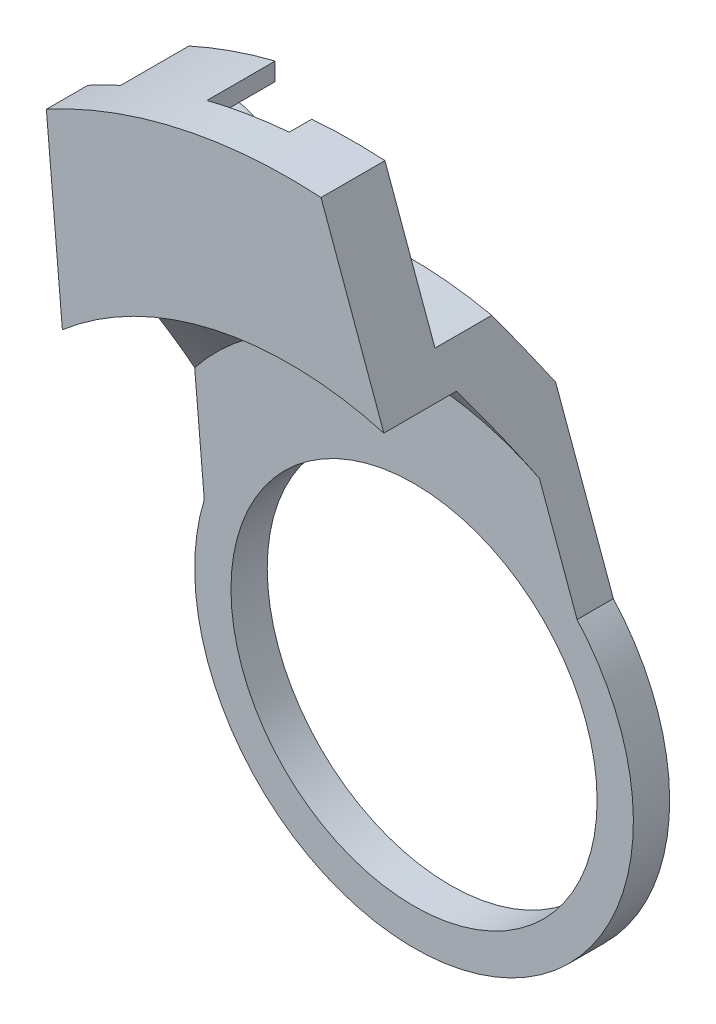
ISO-10303-21;
HEADER;
FILE_DESCRIPTION(('STEP AP214'),'2;1');
FILE_NAME('part.step','',(''),(''),'','','');
FILE_SCHEMA(('AUTOMOTIVE_DESIGN { 1 0 10303 214 1 1 1 1 }'));
ENDSEC;
DATA;
#1=APPLICATION_CONTEXT('core data for automotive mechanical design processes');
#2=APPLICATION_PROTOCOL_DEFINITION('international standard','automotive_design',2000,#1);
#3=PRODUCT_CONTEXT('',#1,'mechanical');
#4=PRODUCT('Part','Part','',(#3));
#5=PRODUCT_RELATED_PRODUCT_CATEGORY('part','',(#4));
#6=PRODUCT_DEFINITION_FORMATION('','',#4);
#7=PRODUCT_DEFINITION_CONTEXT('part definition',#1,'design');
#8=PRODUCT_DEFINITION('design','',#6,#7);
#9=PRODUCT_DEFINITION_SHAPE('','',#8);
#10=(LENGTH_UNIT() NAMED_UNIT(*) SI_UNIT(.MILLI.,.METRE.));
#11=(NAMED_UNIT(*) PLANE_ANGLE_UNIT() SI_UNIT($,.RADIAN.));
#12=(NAMED_UNIT(*) SI_UNIT($,.STERADIAN.) SOLID_ANGLE_UNIT());
#13=UNCERTAINTY_MEASURE_WITH_UNIT(LENGTH_MEASURE(1.E-05),#10,'distance_accuracy_value','');
#14=(GEOMETRIC_REPRESENTATION_CONTEXT(3) GLOBAL_UNCERTAINTY_ASSIGNED_CONTEXT((#13)) GLOBAL_UNIT_ASSIGNED_CONTEXT((#10,
#11,#12)) REPRESENTATION_CONTEXT('',''));
#15=CARTESIAN_POINT('',(0.,0.,0.));
#16=DIRECTION('',(0.,0.,1.));
#17=DIRECTION('',(1.,0.,0.));
#18=AXIS2_PLACEMENT_3D('',#15,#16,#17);
#19=CARTESIAN_POINT('',(0.,0.,0.85));
#20=DIRECTION('',(0.,0.,1.));
#21=DIRECTION('',(1.,0.,0.));
#22=AXIS2_PLACEMENT_3D('',#19,#20,#21);
#23=CYLINDRICAL_SURFACE('',#22,27.55);
#24=CARTESIAN_POINT('',(0.,0.,1.45));
#25=DIRECTION('',(0.,0.,-1.));
#26=DIRECTION('',(-1.,0.,0.));
#27=AXIS2_PLACEMENT_3D('',#24,#25,#26);
#28=CIRCLE('',#27,27.55);
#29=CARTESIAN_POINT('',(-13.7100294494928,23.8963928762071,1.45));
#30=VERTEX_POINT('',#29);
#31=CARTESIAN_POINT('',(-8.80624761480262,26.1046452369456,1.45));
#32=VERTEX_POINT('',#31);
#33=EDGE_CURVE('E163',#30,#32,#28,.T.);
#34=ORIENTED_EDGE('',*,*,#33,.F.);
#35=DIRECTION('',(0.,0.,1.));
#36=VECTOR('',#35,1.);
#37=CARTESIAN_POINT('',(-13.7100294494928,23.8963928762071,0.85));
#38=LINE('',#37,#36);
#39=CARTESIAN_POINT('',(-13.7100294494928,23.8963928762071,4.8));
#40=VERTEX_POINT('',#39);
#41=EDGE_CURVE('E190',#30,#40,#38,.T.);
#42=ORIENTED_EDGE('',*,*,#41,.T.);
#43=CARTESIAN_POINT('',(0.,0.,4.8));
#44=DIRECTION('',(0.,0.,-1.));
#45=DIRECTION('',(1.,0.,0.));
#46=AXIS2_PLACEMENT_3D('',#43,#44,#45);
#47=CIRCLE('',#46,27.55);
#48=CARTESIAN_POINT('',(-8.80624761480262,26.1046452369456,4.8));
#49=VERTEX_POINT('',#48);
#50=EDGE_CURVE('E183',#40,#49,#47,.T.);
#51=ORIENTED_EDGE('',*,*,#50,.T.);
#52=DIRECTION('',(0.,0.,1.));
#53=VECTOR('',#52,1.);
#54=CARTESIAN_POINT('',(-8.80624761480262,26.1046452369456,0.85));
#55=LINE('',#54,#53);
#56=EDGE_CURVE('E177',#32,#49,#55,.T.);
#57=ORIENTED_EDGE('',*,*,#56,.F.);
#58=EDGE_LOOP('',(#34,#42,#51,#57));
#59=FACE_BOUND('',#58,.T.);
#60=ADVANCED_FACE('F17',(#59),#23,.T.);
#61=CARTESIAN_POINT('',(-9.08773375342576,23.318830176005,0.85));
#62=DIRECTION('',(0.,0.,1.));
#63=DIRECTION('',(1.,0.,0.));
#64=AXIS2_PLACEMENT_3D('',#61,#62,#63);
#65=CYLINDRICAL_SURFACE('',#64,2.8);
#66=CARTESIAN_POINT('',(-9.08773375342576,23.318830176005,1.45));
#67=DIRECTION('',(0.,0.,-1.));
#68=DIRECTION('',(-1.,0.,0.));
#69=AXIS2_PLACEMENT_3D('',#66,#67,#68);
#70=CIRCLE('',#69,2.8);
#71=CARTESIAN_POINT('',(-9.08773375342576,20.518830176005,1.45));
#72=VERTEX_POINT('',#71);
#73=EDGE_CURVE('E166',#32,#72,#70,.T.);
#74=ORIENTED_EDGE('',*,*,#73,.F.);
#75=ORIENTED_EDGE('',*,*,#56,.T.);
#76=CARTESIAN_POINT('',(-9.08773375342576,23.318830176005,4.8));
#77=DIRECTION('',(0.,0.,-1.));
#78=DIRECTION('',(-1.,0.,0.));
#79=AXIS2_PLACEMENT_3D('',#76,#77,#78);
#80=CIRCLE('',#79,2.8);
#81=CARTESIAN_POINT('',(-9.08773375342576,20.518830176005,4.8));
#82=VERTEX_POINT('',#81);
#83=EDGE_CURVE('E186',#49,#82,#80,.T.);
#84=ORIENTED_EDGE('',*,*,#83,.T.);
#85=DIRECTION('',(0.,0.,1.));
#86=VECTOR('',#85,1.);
#87=CARTESIAN_POINT('',(-9.08773375342576,20.518830176005,0.85));
#88=LINE('',#87,#86);
#89=EDGE_CURVE('E179',#72,#82,#88,.T.);
#90=ORIENTED_EDGE('',*,*,#89,.F.);
#91=EDGE_LOOP('',(#74,#75,#84,#90));
#92=FACE_BOUND('',#91,.T.);
#93=ADVANCED_FACE('F175',(#92),#65,.T.);
#94=CARTESIAN_POINT('',(-9.08773375342576,20.518830176005,0.85));
#95=DIRECTION('',(0.,1.,0.));
#96=DIRECTION('',(0.,0.,1.));
#97=AXIS2_PLACEMENT_3D('',#94,#95,#96);
#98=PLANE('',#97);
#99=DIRECTION('',(-1.,0.,0.));
#100=VECTOR('',#99,1.);
#101=CARTESIAN_POINT('',(-9.08773375342576,20.518830176005,1.45));
#102=LINE('',#101,#100);
#103=CARTESIAN_POINT('',(-10.5652042274245,20.518830176005,1.45));
#104=VERTEX_POINT('',#103);
#105=EDGE_CURVE('E180',#72,#104,#102,.T.);
#106=ORIENTED_EDGE('',*,*,#105,.F.);
#107=ORIENTED_EDGE('',*,*,#89,.T.);
#108=DIRECTION('',(-1.,0.,0.));
#109=VECTOR('',#108,1.);
#110=CARTESIAN_POINT('',(-9.08773375342576,20.518830176005,4.8));
#111=LINE('',#110,#109);
#112=CARTESIAN_POINT('',(-10.5652042274245,20.518830176005,4.8));
#113=VERTEX_POINT('',#112);
#114=EDGE_CURVE('E185',#82,#113,#111,.T.);
#115=ORIENTED_EDGE('',*,*,#114,.T.);
#116=DIRECTION('',(0.,0.,1.));
#117=VECTOR('',#116,1.);
#118=CARTESIAN_POINT('',(-10.5652042274245,20.518830176005,0.85));
#119=LINE('',#118,#117);
#120=EDGE_CURVE('E198',#104,#113,#119,.T.);
#121=ORIENTED_EDGE('',*,*,#120,.F.);
#122=EDGE_LOOP('',(#106,#107,#115,#121));
#123=FACE_BOUND('',#122,.T.);
#124=ADVANCED_FACE('F360',(#123),#98,.F.);
#125=CARTESIAN_POINT('',(-10.5652042274245,20.518830176005,0.85));
#126=DIRECTION('',(0.4226182617407,0.906307787036649,0.));
#127=DIRECTION('',(-0.906307787036649,0.4226182617407,0.));
#128=AXIS2_PLACEMENT_3D('',#125,#126,#127);
#129=PLANE('',#128);
#130=DIRECTION('',(-0.906307787036649,0.4226182617407,0.));
#131=VECTOR('',#130,1.);
#132=CARTESIAN_POINT('',(-10.5652042274245,20.518830176005,1.45));
#133=LINE('',#132,#131);
#134=CARTESIAN_POINT('',(-13.5357179639975,21.9040034800236,1.45));
#135=VERTEX_POINT('',#134);
#136=EDGE_CURVE('E37',#104,#135,#133,.T.);
#137=ORIENTED_EDGE('',*,*,#136,.F.);
#138=ORIENTED_EDGE('',*,*,#120,.T.);
#139=DIRECTION('',(-0.906307787036649,0.4226182617407,0.));
#140=VECTOR('',#139,1.);
#141=CARTESIAN_POINT('',(-10.5652042274245,20.518830176005,4.8));
#142=LINE('',#141,#140);
#143=CARTESIAN_POINT('',(-13.5357179639975,21.9040034800236,4.8));
#144=VERTEX_POINT('',#143);
#145=EDGE_CURVE('E197',#113,#144,#142,.T.);
#146=ORIENTED_EDGE('',*,*,#145,.T.);
#147=DIRECTION('',(0.,0.,1.));
#148=VECTOR('',#147,1.);
#149=CARTESIAN_POINT('',(-13.5357179639975,21.9040034800236,0.85));
#150=LINE('',#149,#148);
#151=EDGE_CURVE('E201',#135,#144,#150,.T.);
#152=ORIENTED_EDGE('',*,*,#151,.F.);
#153=EDGE_LOOP('',(#137,#138,#146,#152));
#154=FACE_BOUND('',#153,.T.);
#155=ADVANCED_FACE('F365',(#154),#129,.F.);
#156=CARTESIAN_POINT('',(-13.5357179639975,21.9040034800236,0.85));
#157=DIRECTION('',(0.996194698091745,0.0871557427476623,0.));
#158=DIRECTION('',(-0.0871557427476623,0.996194698091745,0.));
#159=AXIS2_PLACEMENT_3D('',#156,#157,#158);
#160=PLANE('',#159);
#161=DIRECTION('',(-0.0871557427476621,0.996194698091745,0.));
#162=VECTOR('',#161,1.);
#163=CARTESIAN_POINT('',(-13.5357179639975,21.9040034800236,1.45));
#164=LINE('',#163,#162);
#165=EDGE_CURVE('E168',#135,#30,#164,.T.);
#166=ORIENTED_EDGE('',*,*,#165,.F.);
#167=ORIENTED_EDGE('',*,*,#151,.T.);
#168=DIRECTION('',(-0.0871557427476623,0.996194698091745,0.));
#169=VECTOR('',#168,1.);
#170=CARTESIAN_POINT('',(-13.5357179639975,21.9040034800236,4.8));
#171=LINE('',#170,#169);
#172=EDGE_CURVE('E200',#144,#40,#171,.T.);
#173=ORIENTED_EDGE('',*,*,#172,.T.);
#174=ORIENTED_EDGE('',*,*,#41,.F.);
#175=EDGE_LOOP('',(#166,#167,#173,#174));
#176=FACE_BOUND('',#175,.T.);
#177=ADVANCED_FACE('F369',(#176),#160,.F.);
#178=CARTESIAN_POINT('',(0.,0.,4.8));
#179=DIRECTION('',(0.,0.,-1.));
#180=DIRECTION('',(-1.,0.,0.));
#181=AXIS2_PLACEMENT_3D('',#178,#179,#180);
#182=PLANE('',#181);
#183=ORIENTED_EDGE('',*,*,#83,.F.);
#184=ORIENTED_EDGE('',*,*,#50,.F.);
#185=ORIENTED_EDGE('',*,*,#172,.F.);
#186=ORIENTED_EDGE('',*,*,#145,.F.);
#187=ORIENTED_EDGE('',*,*,#114,.F.);
#188=EDGE_LOOP('',(#183,#184,#185,#186,#187));
#189=FACE_BOUND('',#188,.T.);
#190=CARTESIAN_POINT('',(0.,0.,4.8));
#191=DIRECTION('',(0.,0.,-1.));
#192=DIRECTION('',(-1.,0.,0.));
#193=AXIS2_PLACEMENT_3D('',#190,#191,#192);
#194=CIRCLE('',#193,29.5);
#195=CARTESIAN_POINT('',(-7.18773375342576,28.6109504122087,4.8));
#196=VERTEX_POINT('',#195);
#197=CARTESIAN_POINT('',(-2.42470673773855,29.4001836258886,4.8));
#198=VERTEX_POINT('',#197);
#199=EDGE_CURVE('E243',#196,#198,#194,.T.);
#200=ORIENTED_EDGE('',*,*,#199,.T.);
#201=DIRECTION('',(-0.342020143325672,0.939692620785907,0.));
#202=VECTOR('',#201,1.);
#203=CARTESIAN_POINT('',(-2.42470673773856,29.4001836258886,4.8));
#204=LINE('',#203,#202);
#205=CARTESIAN_POINT('',(0.269339940357037,21.9983512108641,4.8));
#206=VERTEX_POINT('',#205);
#207=EDGE_CURVE('E470',#206,#198,#204,.T.);
#208=ORIENTED_EDGE('',*,*,#207,.F.);
#209=CARTESIAN_POINT('',(0.,0.,4.8));
#210=DIRECTION('',(0.,0.,1.));
#211=DIRECTION('',(-1.,0.,0.));
#212=AXIS2_PLACEMENT_3D('',#209,#210,#211);
#213=CIRCLE('',#212,22.);
#214=CARTESIAN_POINT('',(-13.35,17.4864947888363,4.8));
#215=VERTEX_POINT('',#214);
#216=EDGE_CURVE('E246',#206,#215,#213,.T.);
#217=ORIENTED_EDGE('',*,*,#216,.T.);
#218=DIRECTION('',(-0.0871557427476605,0.996194698091745,0.));
#219=VECTOR('',#218,1.);
#220=CARTESIAN_POINT('',(-13.35,17.4864947888363,4.8));
#221=LINE('',#220,#219);
#222=CARTESIAN_POINT('',(-14.0877337534258,25.918830176005,4.8));
#223=VERTEX_POINT('',#222);
#224=EDGE_CURVE('E248',#215,#223,#221,.T.);
#225=ORIENTED_EDGE('',*,*,#224,.T.);
#226=CARTESIAN_POINT('',(-12.1877337534258,26.8646449065609,4.8));
#227=VERTEX_POINT('',#226);
#228=EDGE_CURVE('E244',#223,#227,#194,.T.);
#229=ORIENTED_EDGE('',*,*,#228,.T.);
#230=DIRECTION('',(0.,1.,0.));
#231=VECTOR('',#230,1.);
#232=CARTESIAN_POINT('',(-12.1877337534258,25.7625531723004,4.8));
#233=LINE('',#232,#231);
#234=CARTESIAN_POINT('',(-12.1877337534258,25.7625531723004,4.8));
#235=VERTEX_POINT('',#234);
#236=EDGE_CURVE('E213',#235,#227,#233,.T.);
#237=ORIENTED_EDGE('',*,*,#236,.F.);
#238=CARTESIAN_POINT('',(0.,0.,4.8));
#239=DIRECTION('',(0.,0.,1.));
#240=DIRECTION('',(1.,0.,0.));
#241=AXIS2_PLACEMENT_3D('',#238,#239,#240);
#242=CIRCLE('',#241,28.5);
#243=CARTESIAN_POINT('',(-7.18773375342576,27.5787324489336,4.8));
#244=VERTEX_POINT('',#243);
#245=EDGE_CURVE('E203',#244,#235,#242,.T.);
#246=ORIENTED_EDGE('',*,*,#245,.F.);
#247=DIRECTION('',(0.,-1.,0.));
#248=VECTOR('',#247,1.);
#249=CARTESIAN_POINT('',(-7.18773375342576,27.5787324489336,4.8));
#250=LINE('',#249,#248);
#251=EDGE_CURVE('E216',#196,#244,#250,.T.);
#252=ORIENTED_EDGE('',*,*,#251,.F.);
#253=EDGE_LOOP('',(#200,#208,#217,#225,#229,#237,#246,#252));
#254=FACE_BOUND('',#253,.T.);
#255=ADVANCED_FACE('F373',(#189,#254),#182,.T.);
#256=CARTESIAN_POINT('',(0.,0.,-2.1));
#257=DIRECTION('',(0.,0.,1.));
#258=DIRECTION('',(1.,0.,0.));
#259=AXIS2_PLACEMENT_3D('',#256,#257,#258);
#260=CYLINDRICAL_SURFACE('',#259,22.);
#261=DIRECTION('',(0.,0.,1.));
#262=VECTOR('',#261,1.);
#263=CARTESIAN_POINT('',(0.269339940357079,21.9983512108641,-9.87786934547322));
#264=LINE('',#263,#262);
#265=CARTESIAN_POINT('',(0.269339940357079,21.9983512108641,3.5));
#266=VERTEX_POINT('',#265);
#267=EDGE_CURVE('E45',#266,#206,#264,.T.);
#268=ORIENTED_EDGE('',*,*,#267,.F.);
#269=CARTESIAN_POINT('',(0.,0.,3.5));
#270=DIRECTION('',(0.,0.,1.));
#271=DIRECTION('',(1.,0.,0.));
#272=AXIS2_PLACEMENT_3D('',#269,#270,#271);
#273=CIRCLE('',#272,22.);
#274=CARTESIAN_POINT('',(4.71120765737245,21.4896375588122,3.5));
#275=VERTEX_POINT('',#274);
#276=EDGE_CURVE('E477',#266,#275,#273,.F.);
#277=ORIENTED_EDGE('',*,*,#276,.T.);
#278=DIRECTION('',(0.,0.,1.));
#279=VECTOR('',#278,1.);
#280=CARTESIAN_POINT('',(4.71120765737249,21.4896375588122,-2.09999999999996));
#281=LINE('',#280,#279);
#282=CARTESIAN_POINT('',(4.71120765737247,21.4896375588122,0.210684876092078));
#283=VERTEX_POINT('',#282);
#284=EDGE_CURVE('E294',#283,#275,#281,.T.);
#285=ORIENTED_EDGE('',*,*,#284,.F.);
#286=CARTESIAN_POINT('',(0.,0.,0.210684876092046));
#287=DIRECTION('',(0.,0.,-1.));
#288=DIRECTION('',(-1.,0.,0.));
#289=AXIS2_PLACEMENT_3D('',#286,#287,#288);
#290=CIRCLE('',#289,22.);
#291=CARTESIAN_POINT('',(-13.35,17.4864947888363,0.21068487609195));
#292=VERTEX_POINT('',#291);
#293=EDGE_CURVE('E314',#283,#292,#290,.F.);
#294=ORIENTED_EDGE('',*,*,#293,.T.);
#295=DIRECTION('',(0.,0.,1.));
#296=VECTOR('',#295,1.);
#297=CARTESIAN_POINT('',(-13.35,17.4864947888363,-2.10000000000009));
#298=LINE('',#297,#296);
#299=EDGE_CURVE('E297',#292,#215,#298,.T.);
#300=ORIENTED_EDGE('',*,*,#299,.T.);
#301=ORIENTED_EDGE('',*,*,#216,.F.);
#302=EDGE_LOOP('',(#268,#277,#285,#294,#300,#301));
#303=FACE_BOUND('',#302,.T.);
#304=ADVANCED_FACE('F329',(#303),#260,.T.);
#305=CARTESIAN_POINT('',(0.,0.,0.));
#306=DIRECTION('',(0.,0.,-1.));
#307=DIRECTION('',(-1.,0.,0.));
#308=AXIS2_PLACEMENT_3D('',#305,#306,#307);
#309=PLANE('',#308);
#310=CARTESIAN_POINT('',(0.,0.,0.));
#311=DIRECTION('',(0.,0.,-1.));
#312=DIRECTION('',(-1.,0.,0.));
#313=AXIS2_PLACEMENT_3D('',#310,#311,#312);
#314=CIRCLE('',#313,10.6);
#315=CARTESIAN_POINT('',(-10.6,0.,0.));
#316=VERTEX_POINT('',#315);
#317=EDGE_CURVE('E269',#316,#316,#314,.T.);
#318=ORIENTED_EDGE('',*,*,#317,.T.);
#319=EDGE_LOOP('',(#318));
#320=FACE_BOUND('',#319,.T.);
#321=DIRECTION('',(0.342020143325672,-0.939692620785907,0.));
#322=VECTOR('',#321,1.);
#323=CARTESIAN_POINT('',(9.44104993694518,8.49450269810466,0.));
#324=LINE('',#323,#322);
#325=CARTESIAN_POINT('',(7.2621136499808,14.4810809449695,0.));
#326=VERTEX_POINT('',#325);
#327=CARTESIAN_POINT('',(9.44104993694518,8.49450269810466,0.));
#328=VERTEX_POINT('',#327);
#329=EDGE_CURVE('E281',#326,#328,#324,.T.);
#330=ORIENTED_EDGE('',*,*,#329,.F.);
#331=CARTESIAN_POINT('',(0.,0.,0.));
#332=DIRECTION('',(0.,0.,-1.));
#333=DIRECTION('',(-1.,0.,0.));
#334=AXIS2_PLACEMENT_3D('',#331,#332,#333);
#335=CIRCLE('',#334,16.2);
#336=CARTESIAN_POINT('',(-12.7000295316049,10.0572983398306,0.));
#337=VERTEX_POINT('',#336);
#338=EDGE_CURVE('E336',#326,#337,#335,.F.);
#339=ORIENTED_EDGE('',*,*,#338,.T.);
#340=DIRECTION('',(-0.0871557427476617,0.996194698091745,0.));
#341=VECTOR('',#340,1.);
#342=CARTESIAN_POINT('',(-12.1450047037638,3.71333552827576,0.));
#343=LINE('',#342,#341);
#344=CARTESIAN_POINT('',(-12.1450047037638,3.71333552827576,0.));
#345=VERTEX_POINT('',#344);
#346=EDGE_CURVE('E278',#345,#337,#343,.T.);
#347=ORIENTED_EDGE('',*,*,#346,.F.);
#348=CARTESIAN_POINT('',(0.,0.,0.));
#349=DIRECTION('',(0.,0.,-1.));
#350=DIRECTION('',(-1.,0.,0.));
#351=AXIS2_PLACEMENT_3D('',#348,#349,#350);
#352=CIRCLE('',#351,12.7);
#353=EDGE_CURVE('E275',#328,#345,#352,.T.);
#354=ORIENTED_EDGE('',*,*,#353,.F.);
#355=EDGE_LOOP('',(#330,#339,#347,#354));
#356=FACE_BOUND('',#355,.T.);
#357=ADVANCED_FACE('F408',(#320,#356),#309,.F.);
#358=CARTESIAN_POINT('',(0.,0.,-2.1));
#359=DIRECTION('',(0.,0.,-1.));
#360=DIRECTION('',(-1.,0.,0.));
#361=AXIS2_PLACEMENT_3D('',#358,#359,#360);
#362=PLANE('',#361);
#363=DIRECTION('',(-0.0871557427476617,0.996194698091745,0.));
#364=VECTOR('',#363,1.);
#365=CARTESIAN_POINT('',(-12.1450047037638,3.71333552827576,-2.10000000000008));
#366=LINE('',#365,#364);
#367=CARTESIAN_POINT('',(-12.1450047037638,3.71333552827576,-2.10000000000008));
#368=VERTEX_POINT('',#367);
#369=CARTESIAN_POINT('',(-12.9964605343085,13.4455202048921,-2.10000000000009));
#370=VERTEX_POINT('',#369);
#371=EDGE_CURVE('E286',#368,#370,#366,.T.);
#372=ORIENTED_EDGE('',*,*,#371,.T.);
#373=CARTESIAN_POINT('',(0.,0.,-2.1));
#374=DIRECTION('',(0.,0.,-1.));
#375=DIRECTION('',(-1.,0.,0.));
#376=AXIS2_PLACEMENT_3D('',#373,#374,#375);
#377=CIRCLE('',#376,18.7);
#378=CARTESIAN_POINT('',(6.09869221354234,17.6775550708936,-2.09999999999996));
#379=VERTEX_POINT('',#378);
#380=EDGE_CURVE('E303',#370,#379,#377,.T.);
#381=ORIENTED_EDGE('',*,*,#380,.T.);
#382=DIRECTION('',(0.342020143325672,-0.939692620785907,0.));
#383=VECTOR('',#382,1.);
#384=CARTESIAN_POINT('',(9.4410499369452,8.49450269810466,-2.09999999999993));
#385=LINE('',#384,#383);
#386=CARTESIAN_POINT('',(9.4410499369452,8.49450269810466,-2.09999999999993));
#387=VERTEX_POINT('',#386);
#388=EDGE_CURVE('E289',#379,#387,#385,.T.);
#389=ORIENTED_EDGE('',*,*,#388,.T.);
#390=CARTESIAN_POINT('',(0.,0.,-2.1));
#391=DIRECTION('',(0.,0.,-1.));
#392=DIRECTION('',(-1.,0.,0.));
#393=AXIS2_PLACEMENT_3D('',#390,#391,#392);
#394=CIRCLE('',#393,12.7);
#395=EDGE_CURVE('E283',#387,#368,#394,.T.);
#396=ORIENTED_EDGE('',*,*,#395,.T.);
#397=EDGE_LOOP('',(#372,#381,#389,#396));
#398=FACE_BOUND('',#397,.T.);
#399=CARTESIAN_POINT('',(0.,0.,-2.1));
#400=DIRECTION('',(0.,0.,-1.));
#401=DIRECTION('',(-1.,0.,0.));
#402=AXIS2_PLACEMENT_3D('',#399,#400,#401);
#403=CIRCLE('',#402,10.6);
#404=CARTESIAN_POINT('',(-10.6,0.,-2.10000000000007));
#405=VERTEX_POINT('',#404);
#406=EDGE_CURVE('E272',#405,#405,#403,.T.);
#407=ORIENTED_EDGE('',*,*,#406,.F.);
#408=EDGE_LOOP('',(#407));
#409=FACE_BOUND('',#408,.T.);
#410=ADVANCED_FACE('F327',(#398,#409),#362,.T.);
#411=CARTESIAN_POINT('',(0.,0.,-2.1));
#412=DIRECTION('',(0.,0.,1.));
#413=DIRECTION('',(1.,0.,0.));
#414=AXIS2_PLACEMENT_3D('',#411,#412,#413);
#415=CYLINDRICAL_SURFACE('',#414,12.7);
#416=ORIENTED_EDGE('',*,*,#353,.T.);
#417=DIRECTION('',(0.,0.,1.));
#418=VECTOR('',#417,1.);
#419=CARTESIAN_POINT('',(-12.1450047037638,3.71333552827576,-2.10000000000008));
#420=LINE('',#419,#418);
#421=EDGE_CURVE('E300',#368,#345,#420,.T.);
#422=ORIENTED_EDGE('',*,*,#421,.F.);
#423=ORIENTED_EDGE('',*,*,#395,.F.);
#424=DIRECTION('',(0.,0.,1.));
#425=VECTOR('',#424,1.);
#426=CARTESIAN_POINT('',(9.4410499369452,8.49450269810466,-2.09999999999993));
#427=LINE('',#426,#425);
#428=EDGE_CURVE('E291',#387,#328,#427,.T.);
#429=ORIENTED_EDGE('',*,*,#428,.T.);
#430=EDGE_LOOP('',(#416,#422,#423,#429));
#431=FACE_BOUND('',#430,.T.);
#432=ADVANCED_FACE('F19',(#431),#415,.T.);
#433=CARTESIAN_POINT('',(-12.1450047037638,3.71333552827576,-2.10000000000008));
#434=DIRECTION('',(0.996194698091745,0.0871557427476617,0.));
#435=DIRECTION('',(-0.0871557427476617,0.996194698091745,0.));
#436=AXIS2_PLACEMENT_3D('',#433,#434,#435);
#437=PLANE('',#436);
#438=ORIENTED_EDGE('',*,*,#299,.F.);
#439=CARTESIAN_POINT('',(-13.35,17.4864947888363,0.210684876091952));
#440=CARTESIAN_POINT('',(-13.3208135355553,17.1528919737008,0.0126280825053441));
#441=CARTESIAN_POINT('',(-13.2915692061198,16.8186277586933,-0.184312093127229));
#442=CARTESIAN_POINT('',(-13.2329509022123,16.1486174791315,-0.57557276921442));
#443=CARTESIAN_POINT('',(-13.2035769382491,15.8128715346933,-0.769893477019836));
#444=CARTESIAN_POINT('',(-13.144680267403,15.1396795064639,-1.15556397331109));
#445=CARTESIAN_POINT('',(-13.115157557803,14.8022333916164,-1.3469137072646));
#446=CARTESIAN_POINT('',(-13.055941486756,14.125390602385,-1.72616719532516));
#447=CARTESIAN_POINT('',(-13.0262481118897,13.7859937746177,-1.91407067344867));
#448=CARTESIAN_POINT('',(-12.9964605343085,13.4455202048921,-2.10000000000009));
#449=B_SPLINE_CURVE_WITH_KNOTS('',3,(#439,#440,#441,#442,#443,#444,#445,#446,#447,#448),
.UNSPECIFIED.,.F.,.F.,(4,2,2,2,4),(0.,1.16718792952777,2.33428291820314,3.5013993036859,
4.66860874979906),.UNSPECIFIED.);
#450=EDGE_CURVE('E426',#292,#370,#449,.T.);
#451=ORIENTED_EDGE('',*,*,#450,.T.);
#452=ORIENTED_EDGE('',*,*,#371,.F.);
#453=ORIENTED_EDGE('',*,*,#421,.T.);
#454=ORIENTED_EDGE('',*,*,#346,.T.);
#455=CARTESIAN_POINT('',(-12.7000295316049,10.0572983398306,0.));
#456=CARTESIAN_POINT('',(-12.7196632564629,10.2817128418554,0.116040973139817));
#457=CARTESIAN_POINT('',(-12.7392309765462,10.5053729058533,0.233540813811844));
#458=CARTESIAN_POINT('',(-12.7782439838715,10.9512936200695,0.471171993058312));
#459=CARTESIAN_POINT('',(-12.797689274701,11.1735543112929,0.591303254059072));
#460=CARTESIAN_POINT('',(-12.8558453373986,11.8382811496488,0.955148537336075));
#461=CARTESIAN_POINT('',(-12.8943886985474,12.2788337835044,1.20238777595536));
#462=CARTESIAN_POINT('',(-12.9710924457275,13.1555616255899,1.70444071175838));
#463=CARTESIAN_POINT('',(-13.0092528692682,13.5917372625563,1.95925365719961));
#464=CARTESIAN_POINT('',(-13.0662581050014,14.243310088518,2.34618386668656));
#465=CARTESIAN_POINT('',(-13.085223663507,14.4600874141877,2.47596709398291));
#466=CARTESIAN_POINT('',(-13.1230801823881,14.8927894049991,2.73695286529456));
#467=CARTESIAN_POINT('',(-13.1419711435952,15.1087140796458,2.86815539342646));
#468=CARTESIAN_POINT('',(-13.1608280025071,15.3242489632747,3.));
#469=B_SPLINE_CURVE_WITH_KNOTS('',3,(#455,#456,#457,#458,#459,#460,#461,#462,#463,#464,#465,
#466,#467,#468),.UNSPECIFIED.,.F.,.F.,(4,2,2,2,2,2,4),(0.,0.760194183971169,1.52036598766901,
3.04022902007841,4.55994169611442,5.32004379715684,6.08013740068076),.UNSPECIFIED.);
#470=CARTESIAN_POINT('',(-13.1608280025071,15.3242489632747,3.));
#471=VERTEX_POINT('',#470);
#472=EDGE_CURVE('E11',#337,#471,#469,.T.);
#473=ORIENTED_EDGE('',*,*,#472,.T.);
#474=DIRECTION('',(0.,0.,-1.));
#475=VECTOR('',#474,1.);
#476=CARTESIAN_POINT('',(-13.1608280025071,15.3242489632747,7.2));
#477=LINE('',#476,#475);
#478=CARTESIAN_POINT('',(-13.1608280025071,15.3242489632747,7.2));
#479=VERTEX_POINT('',#478);
#480=EDGE_CURVE('E263',#479,#471,#477,.T.);
#481=ORIENTED_EDGE('',*,*,#480,.F.);
#482=DIRECTION('',(0.0871557427476607,-0.996194698091745,0.));
#483=VECTOR('',#482,1.);
#484=CARTESIAN_POINT('',(-13.1608280025071,15.3242489632747,7.2));
#485=LINE('',#484,#483);
#486=CARTESIAN_POINT('',(-14.0877337534258,25.918830176005,7.2));
#487=VERTEX_POINT('',#486);
#488=EDGE_CURVE('E261',#487,#479,#485,.T.);
#489=ORIENTED_EDGE('',*,*,#488,.F.);
#490=DIRECTION('',(0.,0.,1.));
#491=VECTOR('',#490,1.);
#492=CARTESIAN_POINT('',(-14.0877337534258,25.918830176005,4.8));
#493=LINE('',#492,#491);
#494=EDGE_CURVE('E250',#223,#487,#493,.T.);
#495=ORIENTED_EDGE('',*,*,#494,.F.);
#496=ORIENTED_EDGE('',*,*,#224,.F.);
#497=EDGE_LOOP('',(#438,#451,#452,#453,#454,#473,#481,#489,#495,#496));
#498=FACE_BOUND('',#497,.T.);
#499=ADVANCED_FACE('F325',(#498),#437,.F.);
#500=CARTESIAN_POINT('',(9.4410499369452,8.49450269810466,-2.09999999999993));
#501=DIRECTION('',(-0.939692620785907,-0.342020143325672,0.));
#502=DIRECTION('',(0.342020143325672,-0.939692620785907,0.));
#503=AXIS2_PLACEMENT_3D('',#500,#501,#502);
#504=PLANE('',#503);
#505=ORIENTED_EDGE('',*,*,#388,.F.);
#506=CARTESIAN_POINT('',(6.09869221354234,17.6775550708936,-2.09999999999996));
#507=CARTESIAN_POINT('',(5.98178882227377,17.9987444986617,-1.9140740839902));
#508=CARTESIAN_POINT('',(5.86525526198425,18.3189178241658,-1.72617298448005));
#509=CARTESIAN_POINT('',(5.63285821679118,18.9574234581817,-1.34692247685162));
#510=CARTESIAN_POINT('',(5.51699467915911,19.275755911564,-1.15557334509743));
#511=CARTESIAN_POINT('',(5.28585158125516,19.9108163537178,-0.769902541346014));
#512=CARTESIAN_POINT('',(5.17057201030686,20.2275443718227,-0.575580923956549));
#513=CARTESIAN_POINT('',(4.94052175961255,20.8596022409452,-0.184317107060296));
#514=CARTESIAN_POINT('',(4.825751121159,21.1749319785127,0.0126253000801795));
#515=CARTESIAN_POINT('',(4.71120765737248,21.4896375588122,0.210684876092079));
#516=B_SPLINE_CURVE_WITH_KNOTS('',3,(#506,#507,#508,#509,#510,#511,#512,#513,#514,#515),
.UNSPECIFIED.,.F.,.F.,(4,2,2,2,4),(0.,1.16727971816436,2.33446628992401,3.50163144489886,
4.66888962638052),.UNSPECIFIED.);
#517=EDGE_CURVE('E306',#379,#283,#516,.T.);
#518=ORIENTED_EDGE('',*,*,#517,.T.);
#519=ORIENTED_EDGE('',*,*,#284,.T.);
#520=DIRECTION('',(-0.342020143325671,0.939692620785907,0.));
#521=VECTOR('',#520,1.);
#522=CARTESIAN_POINT('',(4.71120765737247,21.4896375588122,3.5));
#523=LINE('',#522,#521);
#524=CARTESIAN_POINT('',(1.81603877507083,29.4440486884437,3.5));
#525=VERTEX_POINT('',#524);
#526=EDGE_CURVE('E210',#275,#525,#523,.T.);
#527=ORIENTED_EDGE('',*,*,#526,.T.);
#528=DIRECTION('',(0.,0.,1.));
#529=VECTOR('',#528,1.);
#530=CARTESIAN_POINT('',(1.81603877507082,29.4440486884437,4.8));
#531=LINE('',#530,#529);
#532=CARTESIAN_POINT('',(1.81603877507082,29.4440486884437,7.2));
#533=VERTEX_POINT('',#532);
#534=EDGE_CURVE('E253',#525,#533,#531,.T.);
#535=ORIENTED_EDGE('',*,*,#534,.T.);
#536=DIRECTION('',(-0.342020143325673,0.939692620785907,0.));
#537=VECTOR('',#536,1.);
#538=CARTESIAN_POINT('',(4.71120765737247,21.4896375588122,7.2));
#539=LINE('',#538,#537);
#540=CARTESIAN_POINT('',(5.45361649394796,19.4498860443175,7.2));
#541=VERTEX_POINT('',#540);
#542=EDGE_CURVE('E259',#541,#533,#539,.T.);
#543=ORIENTED_EDGE('',*,*,#542,.F.);
#544=DIRECTION('',(0.,0.,-1.));
#545=VECTOR('',#544,1.);
#546=CARTESIAN_POINT('',(5.45361649394796,19.4498860443175,7.2));
#547=LINE('',#546,#545);
#548=CARTESIAN_POINT('',(5.45361649394796,19.4498860443175,3.));
#549=VERTEX_POINT('',#548);
#550=EDGE_CURVE('E266',#541,#549,#547,.T.);
#551=ORIENTED_EDGE('',*,*,#550,.T.);
#552=CARTESIAN_POINT('',(5.45361649394796,19.4498860443175,3.));
#553=CARTESIAN_POINT('',(5.52762356498741,19.2465532877567,2.86815128612103));
#554=CARTESIAN_POINT('',(5.601764527876,19.0428526663637,2.73694501958117));
#555=CARTESIAN_POINT('',(5.75033933400916,18.634646741413,2.47595259889635));
#556=CARTESIAN_POINT('',(5.82477318052209,18.4301414288755,2.3461664606604));
#557=CARTESIAN_POINT('',(6.04850091965948,17.81545451749,1.95922898222783));
#558=CARTESIAN_POINT('',(6.19826888534133,17.4039704136214,1.70441305594661));
#559=CARTESIAN_POINT('',(6.49930816051379,16.5768718027161,1.20235874010898));
#560=CARTESIAN_POINT('',(6.65057961742131,16.1612568906547,0.955121103504433));
#561=CARTESIAN_POINT('',(6.87882571095757,15.5341559025851,0.591282572761348));
#562=CARTESIAN_POINT('',(6.95514307119709,15.3244756786147,0.47115427026186));
#563=CARTESIAN_POINT('',(7.10825844846601,14.903794636997,0.233530662285872));
#564=CARTESIAN_POINT('',(7.18505647959507,14.6927937806114,0.116035434513537));
#565=CARTESIAN_POINT('',(7.26211364998078,14.4810809449696,0.));
#566=B_SPLINE_CURVE_WITH_KNOTS('',3,(#552,#553,#554,#555,#556,#557,#558,#559,#560,#561,#562,
#563,#564,#565),.UNSPECIFIED.,.F.,.F.,(4,2,2,2,2,2,4),(0.,0.760161518634237,1.5203315442828,
3.04017954270029,4.5601780615149,5.32041786563398,6.08068007557926),.UNSPECIFIED.);
#567=EDGE_CURVE('E30',#549,#326,#566,.T.);
#568=ORIENTED_EDGE('',*,*,#567,.T.);
#569=ORIENTED_EDGE('',*,*,#329,.T.);
#570=ORIENTED_EDGE('',*,*,#428,.F.);
#571=EDGE_LOOP('',(#505,#518,#519,#527,#535,#543,#551,#568,#569,#570));
#572=FACE_BOUND('',#571,.T.);
#573=ADVANCED_FACE('F319',(#572),#504,.F.);
#574=CARTESIAN_POINT('',(0.,0.,-2.1));
#575=DIRECTION('',(0.,0.,1.));
#576=DIRECTION('',(1.,0.,0.));
#577=AXIS2_PLACEMENT_3D('',#574,#575,#576);
#578=CYLINDRICAL_SURFACE('',#577,10.6);
#579=ORIENTED_EDGE('',*,*,#406,.T.);
#580=EDGE_LOOP('',(#579));
#581=FACE_BOUND('',#580,.T.);
#582=ORIENTED_EDGE('',*,*,#317,.F.);
#583=EDGE_LOOP('',(#582));
#584=FACE_BOUND('',#583,.T.);
#585=ADVANCED_FACE('F324',(#581,#584),#578,.F.);
#586=CARTESIAN_POINT('',(0.,0.,7.2));
#587=DIRECTION('',(0.,0.,-1.));
#588=DIRECTION('',(-1.,0.,0.));
#589=AXIS2_PLACEMENT_3D('',#586,#587,#588);
#590=CYLINDRICAL_SURFACE('',#589,20.2);
#591=ORIENTED_EDGE('',*,*,#480,.T.);
#592=CARTESIAN_POINT('',(0.,0.,3.));
#593=DIRECTION('',(0.,0.,-1.));
#594=DIRECTION('',(-1.,0.,0.));
#595=AXIS2_PLACEMENT_3D('',#592,#593,#594);
#596=CIRCLE('',#595,20.2);
#597=EDGE_CURVE('E425',#471,#549,#596,.T.);
#598=ORIENTED_EDGE('',*,*,#597,.T.);
#599=ORIENTED_EDGE('',*,*,#550,.F.);
#600=CARTESIAN_POINT('',(0.,0.,7.2));
#601=DIRECTION('',(0.,0.,-1.));
#602=DIRECTION('',(1.,0.,0.));
#603=AXIS2_PLACEMENT_3D('',#600,#601,#602);
#604=CIRCLE('',#603,20.2);
#605=EDGE_CURVE('E256',#479,#541,#604,.T.);
#606=ORIENTED_EDGE('',*,*,#605,.F.);
#607=EDGE_LOOP('',(#591,#598,#599,#606));
#608=FACE_BOUND('',#607,.T.);
#609=ADVANCED_FACE('F401',(#608),#590,.F.);
#610=CARTESIAN_POINT('',(0.,0.,7.2));
#611=DIRECTION('',(0.,0.,1.));
#612=DIRECTION('',(1.,0.,0.));
#613=AXIS2_PLACEMENT_3D('',#610,#611,#612);
#614=PLANE('',#613);
#615=ORIENTED_EDGE('',*,*,#605,.T.);
#616=ORIENTED_EDGE('',*,*,#542,.T.);
#617=CARTESIAN_POINT('',(0.,0.,7.2));
#618=DIRECTION('',(0.,0.,-1.));
#619=DIRECTION('',(-1.,0.,0.));
#620=AXIS2_PLACEMENT_3D('',#617,#618,#619);
#621=CIRCLE('',#620,29.5);
#622=EDGE_CURVE('E240',#487,#533,#621,.T.);
#623=ORIENTED_EDGE('',*,*,#622,.F.);
#624=ORIENTED_EDGE('',*,*,#488,.T.);
#625=EDGE_LOOP('',(#615,#616,#623,#624));
#626=FACE_BOUND('',#625,.T.);
#627=ADVANCED_FACE('F397',(#626),#614,.T.);
#628=CARTESIAN_POINT('',(0.,0.,4.8));
#629=DIRECTION('',(0.,0.,1.));
#630=DIRECTION('',(1.,0.,0.));
#631=AXIS2_PLACEMENT_3D('',#628,#629,#630);
#632=CYLINDRICAL_SURFACE('',#631,29.5);
#633=ORIENTED_EDGE('',*,*,#622,.T.);
#634=ORIENTED_EDGE('',*,*,#534,.F.);
#635=CARTESIAN_POINT('',(0.,0.,3.5));
#636=DIRECTION('',(0.,0.,1.));
#637=DIRECTION('',(1.,0.,0.));
#638=AXIS2_PLACEMENT_3D('',#635,#636,#637);
#639=CIRCLE('',#638,29.5);
#640=CARTESIAN_POINT('',(-2.42470673773855,29.4001836258886,3.5));
#641=VERTEX_POINT('',#640);
#642=EDGE_CURVE('E194',#525,#641,#639,.T.);
#643=ORIENTED_EDGE('',*,*,#642,.T.);
#644=DIRECTION('',(0.,0.,1.));
#645=VECTOR('',#644,1.);
#646=CARTESIAN_POINT('',(-2.42470673773855,29.4001836258886,-9.87786934547322));
#647=LINE('',#646,#645);
#648=EDGE_CURVE('E468',#641,#198,#647,.T.);
#649=ORIENTED_EDGE('',*,*,#648,.T.);
#650=ORIENTED_EDGE('',*,*,#199,.F.);
#651=DIRECTION('',(0.,0.,1.));
#652=VECTOR('',#651,1.);
#653=CARTESIAN_POINT('',(-7.18773375342576,28.6109504122087,0.85));
#654=LINE('',#653,#652);
#655=CARTESIAN_POINT('',(-7.18773375342576,28.6109504122087,0.85));
#656=VERTEX_POINT('',#655);
#657=EDGE_CURVE('E231',#656,#196,#654,.T.);
#658=ORIENTED_EDGE('',*,*,#657,.F.);
#659=CARTESIAN_POINT('',(0.,0.,0.85));
#660=DIRECTION('',(0.,0.,-1.));
#661=DIRECTION('',(-1.,0.,0.));
#662=AXIS2_PLACEMENT_3D('',#659,#660,#661);
#663=CIRCLE('',#662,29.5);
#664=CARTESIAN_POINT('',(-12.1877337534258,26.8646449065609,0.85));
#665=VERTEX_POINT('',#664);
#666=EDGE_CURVE('E224',#665,#656,#663,.T.);
#667=ORIENTED_EDGE('',*,*,#666,.F.);
#668=DIRECTION('',(0.,0.,1.));
#669=VECTOR('',#668,1.);
#670=CARTESIAN_POINT('',(-12.1877337534258,26.8646449065609,0.85));
#671=LINE('',#670,#669);
#672=EDGE_CURVE('E234',#665,#227,#671,.T.);
#673=ORIENTED_EDGE('',*,*,#672,.T.);
#674=ORIENTED_EDGE('',*,*,#228,.F.);
#675=ORIENTED_EDGE('',*,*,#494,.T.);
#676=EDGE_LOOP('',(#633,#634,#643,#649,#650,#658,#667,#673,#674,#675));
#677=FACE_BOUND('',#676,.T.);
#678=ADVANCED_FACE('F390',(#677),#632,.T.);
#679=CARTESIAN_POINT('',(0.,0.,0.85));
#680=DIRECTION('',(0.,0.,1.));
#681=DIRECTION('',(1.,0.,0.));
#682=AXIS2_PLACEMENT_3D('',#679,#680,#681);
#683=CYLINDRICAL_SURFACE('',#682,28.5);
#684=ORIENTED_EDGE('',*,*,#245,.T.);
#685=DIRECTION('',(0.,0.,1.));
#686=VECTOR('',#685,1.);
#687=CARTESIAN_POINT('',(-12.1877337534258,25.7625531723004,0.85));
#688=LINE('',#687,#686);
#689=CARTESIAN_POINT('',(-12.1877337534258,25.7625531723004,0.85));
#690=VERTEX_POINT('',#689);
#691=EDGE_CURVE('E237',#690,#235,#688,.T.);
#692=ORIENTED_EDGE('',*,*,#691,.F.);
#693=CARTESIAN_POINT('',(0.,0.,0.85));
#694=DIRECTION('',(0.,0.,1.));
#695=DIRECTION('',(1.,0.,0.));
#696=AXIS2_PLACEMENT_3D('',#693,#694,#695);
#697=CIRCLE('',#696,28.5);
#698=CARTESIAN_POINT('',(-7.18773375342576,27.5787324489336,0.85));
#699=VERTEX_POINT('',#698);
#700=EDGE_CURVE('E219',#699,#690,#697,.T.);
#701=ORIENTED_EDGE('',*,*,#700,.F.);
#702=DIRECTION('',(0.,0.,1.));
#703=VECTOR('',#702,1.);
#704=CARTESIAN_POINT('',(-7.18773375342576,27.5787324489336,0.85));
#705=LINE('',#704,#703);
#706=EDGE_CURVE('E228',#699,#244,#705,.T.);
#707=ORIENTED_EDGE('',*,*,#706,.T.);
#708=EDGE_LOOP('',(#684,#692,#701,#707));
#709=FACE_BOUND('',#708,.T.);
#710=ADVANCED_FACE('F386',(#709),#683,.F.);
#711=CARTESIAN_POINT('',(-12.1877337534258,25.7625531723004,0.85));
#712=DIRECTION('',(1.,0.,0.));
#713=DIRECTION('',(0.,0.,-1.));
#714=AXIS2_PLACEMENT_3D('',#711,#712,#713);
#715=PLANE('',#714);
#716=ORIENTED_EDGE('',*,*,#236,.T.);
#717=ORIENTED_EDGE('',*,*,#672,.F.);
#718=DIRECTION('',(0.,1.,0.));
#719=VECTOR('',#718,1.);
#720=CARTESIAN_POINT('',(-12.1877337534258,25.7625531723004,0.85));
#721=LINE('',#720,#719);
#722=EDGE_CURVE('E222',#690,#665,#721,.T.);
#723=ORIENTED_EDGE('',*,*,#722,.F.);
#724=ORIENTED_EDGE('',*,*,#691,.T.);
#725=EDGE_LOOP('',(#716,#717,#723,#724));
#726=FACE_BOUND('',#725,.T.);
#727=ADVANCED_FACE('F382',(#726),#715,.F.);
#728=CARTESIAN_POINT('',(-7.18773375342576,27.5787324489336,0.85));
#729=DIRECTION('',(-1.,0.,0.));
#730=DIRECTION('',(0.,0.,1.));
#731=AXIS2_PLACEMENT_3D('',#728,#729,#730);
#732=PLANE('',#731);
#733=ORIENTED_EDGE('',*,*,#251,.T.);
#734=ORIENTED_EDGE('',*,*,#706,.F.);
#735=DIRECTION('',(0.,-1.,0.));
#736=VECTOR('',#735,1.);
#737=CARTESIAN_POINT('',(-7.18773375342576,27.5787324489336,0.85));
#738=LINE('',#737,#736);
#739=EDGE_CURVE('E226',#656,#699,#738,.T.);
#740=ORIENTED_EDGE('',*,*,#739,.F.);
#741=ORIENTED_EDGE('',*,*,#657,.T.);
#742=EDGE_LOOP('',(#733,#734,#740,#741));
#743=FACE_BOUND('',#742,.T.);
#744=ADVANCED_FACE('F378',(#743),#732,.F.);
#745=CARTESIAN_POINT('',(0.,0.,0.85));
#746=DIRECTION('',(0.,0.,1.));
#747=DIRECTION('',(1.,0.,0.));
#748=AXIS2_PLACEMENT_3D('',#745,#746,#747);
#749=PLANE('',#748);
#750=ORIENTED_EDGE('',*,*,#700,.T.);
#751=ORIENTED_EDGE('',*,*,#722,.T.);
#752=ORIENTED_EDGE('',*,*,#666,.T.);
#753=ORIENTED_EDGE('',*,*,#739,.T.);
#754=EDGE_LOOP('',(#750,#751,#752,#753));
#755=FACE_BOUND('',#754,.T.);
#756=ADVANCED_FACE('F375',(#755),#749,.F.);
#757=CARTESIAN_POINT('',(0.,0.,-2.1));
#758=DIRECTION('',(0.,0.,1.));
#759=DIRECTION('',(1.,0.,0.));
#760=AXIS2_PLACEMENT_3D('',#757,#758,#759);
#761=CONICAL_SURFACE('',#760,18.7,0.959931088596884);
#762=ORIENTED_EDGE('',*,*,#450,.F.);
#763=ORIENTED_EDGE('',*,*,#293,.F.);
#764=ORIENTED_EDGE('',*,*,#517,.F.);
#765=ORIENTED_EDGE('',*,*,#380,.F.);
#766=EDGE_LOOP('',(#762,#763,#764,#765));
#767=FACE_BOUND('',#766,.T.);
#768=ADVANCED_FACE('F316',(#767),#761,.T.);
#769=CARTESIAN_POINT('',(0.,0.,3.));
#770=DIRECTION('',(0.,0.,1.));
#771=DIRECTION('',(1.,0.,0.));
#772=AXIS2_PLACEMENT_3D('',#769,#770,#771);
#773=CONICAL_SURFACE('',#772,20.2,0.927295218001612);
#774=ORIENTED_EDGE('',*,*,#472,.F.);
#775=ORIENTED_EDGE('',*,*,#338,.F.);
#776=ORIENTED_EDGE('',*,*,#567,.F.);
#777=ORIENTED_EDGE('',*,*,#597,.F.);
#778=EDGE_LOOP('',(#774,#775,#776,#777));
#779=FACE_BOUND('',#778,.T.);
#780=ADVANCED_FACE('F338',(#779),#773,.F.);
#781=CARTESIAN_POINT('',(-2.42470673773856,29.4001836258886,-9.87786934547322));
#782=DIRECTION('',(0.939692620785907,0.342020143325672,0.));
#783=DIRECTION('',(-0.342020143325672,0.939692620785907,0.));
#784=AXIS2_PLACEMENT_3D('',#781,#782,#783);
#785=PLANE('',#784);
#786=ORIENTED_EDGE('',*,*,#648,.F.);
#787=DIRECTION('',(0.342020143325672,-0.939692620785907,0.));
#788=VECTOR('',#787,1.);
#789=CARTESIAN_POINT('',(-2.42470673773856,29.4001836258886,3.5));
#790=LINE('',#789,#788);
#791=EDGE_CURVE('E473',#641,#266,#790,.T.);
#792=ORIENTED_EDGE('',*,*,#791,.T.);
#793=ORIENTED_EDGE('',*,*,#267,.T.);
#794=ORIENTED_EDGE('',*,*,#207,.T.);
#795=EDGE_LOOP('',(#786,#792,#793,#794));
#796=FACE_BOUND('',#795,.T.);
#797=ADVANCED_FACE('F342',(#796),#785,.F.);
#798=CARTESIAN_POINT('',(0.,0.,3.5));
#799=DIRECTION('',(0.,0.,1.));
#800=DIRECTION('',(1.,0.,0.));
#801=AXIS2_PLACEMENT_3D('',#798,#799,#800);
#802=PLANE('',#801);
#803=ORIENTED_EDGE('',*,*,#642,.F.);
#804=ORIENTED_EDGE('',*,*,#526,.F.);
#805=ORIENTED_EDGE('',*,*,#276,.F.);
#806=ORIENTED_EDGE('',*,*,#791,.F.);
#807=EDGE_LOOP('',(#803,#804,#805,#806));
#808=FACE_BOUND('',#807,.T.);
#809=ADVANCED_FACE('F347',(#808),#802,.F.);
#810=CARTESIAN_POINT('',(0.,0.,1.45));
#811=DIRECTION('',(0.,0.,-1.));
#812=DIRECTION('',(-1.,0.,0.));
#813=AXIS2_PLACEMENT_3D('',#810,#811,#812);
#814=PLANE('',#813);
#815=ORIENTED_EDGE('',*,*,#33,.T.);
#816=ORIENTED_EDGE('',*,*,#73,.T.);
#817=ORIENTED_EDGE('',*,*,#105,.T.);
#818=ORIENTED_EDGE('',*,*,#136,.T.);
#819=ORIENTED_EDGE('',*,*,#165,.T.);
#820=EDGE_LOOP('',(#815,#816,#817,#818,#819));
#821=FACE_BOUND('',#820,.T.);
#822=ADVANCED_FACE('F165',(#821),#814,.T.);
#823=CLOSED_SHELL('',(#60,#93,#124,#155,#177,#255,#304,#357,#410,#432,#499,#573,#585,#609,#627,
#678,#710,#727,#744,#756,#768,#780,#797,#809,#822));
#824=MANIFOLD_SOLID_BREP('B1',#823);
#825=ADVANCED_BREP_SHAPE_REPRESENTATION('',(#18,#824),#14);
#826=SHAPE_DEFINITION_REPRESENTATION(#9,#825);
ENDSEC;
END-ISO-10303-21;
